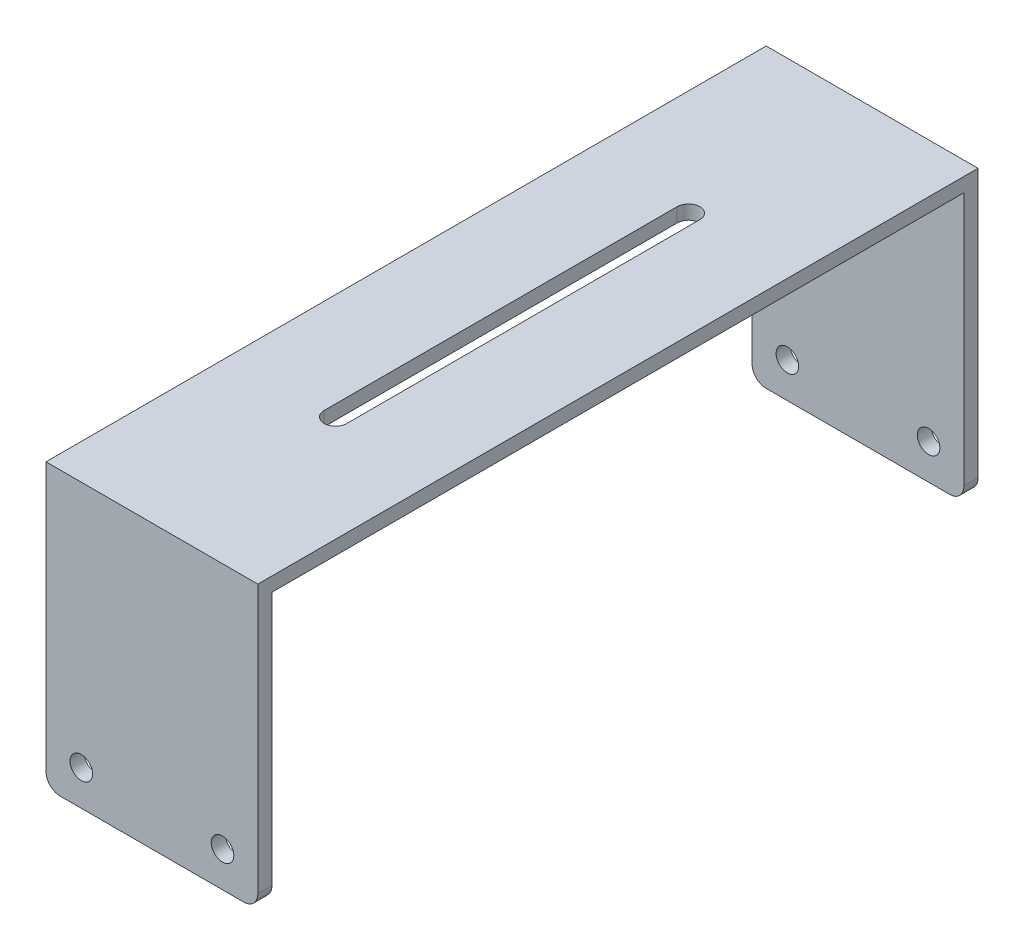
ISO-10303-21;
HEADER;
FILE_DESCRIPTION(('STEP AP214'),'2;1');
FILE_NAME('part.step','',(''),(''),'','','');
FILE_SCHEMA(('AUTOMOTIVE_DESIGN { 1 0 10303 214 1 1 1 1 }'));
ENDSEC;
DATA;
#1=APPLICATION_CONTEXT('core data for automotive mechanical design processes');
#2=APPLICATION_PROTOCOL_DEFINITION('international standard','automotive_design',2000,#1);
#3=PRODUCT_CONTEXT('',#1,'mechanical');
#4=PRODUCT('Part','Part','',(#3));
#5=PRODUCT_RELATED_PRODUCT_CATEGORY('part','',(#4));
#6=PRODUCT_DEFINITION_FORMATION('','',#4);
#7=PRODUCT_DEFINITION_CONTEXT('part definition',#1,'design');
#8=PRODUCT_DEFINITION('design','',#6,#7);
#9=PRODUCT_DEFINITION_SHAPE('','',#8);
#10=(LENGTH_UNIT() NAMED_UNIT(*) SI_UNIT(.MILLI.,.METRE.));
#11=(NAMED_UNIT(*) PLANE_ANGLE_UNIT() SI_UNIT($,.RADIAN.));
#12=(NAMED_UNIT(*) SI_UNIT($,.STERADIAN.) SOLID_ANGLE_UNIT());
#13=UNCERTAINTY_MEASURE_WITH_UNIT(LENGTH_MEASURE(1.E-05),#10,'distance_accuracy_value','');
#14=(GEOMETRIC_REPRESENTATION_CONTEXT(3) GLOBAL_UNCERTAINTY_ASSIGNED_CONTEXT((#13)) GLOBAL_UNIT_ASSIGNED_CONTEXT((#10,
#11,#12)) REPRESENTATION_CONTEXT('',''));
#15=CARTESIAN_POINT('',(0.,0.,0.));
#16=DIRECTION('',(0.,0.,1.));
#17=DIRECTION('',(1.,0.,0.));
#18=AXIS2_PLACEMENT_3D('',#15,#16,#17);
#19=CARTESIAN_POINT('',(30.,38.,-100.));
#20=DIRECTION('',(0.,1.,0.));
#21=DIRECTION('',(0.,0.,1.));
#22=AXIS2_PLACEMENT_3D('',#19,#20,#21);
#23=PLANE('',#22);
#24=DIRECTION('',(0.,0.,-1.));
#25=VECTOR('',#24,1.);
#26=CARTESIAN_POINT('',(13.4,38.,-24.));
#27=LINE('',#26,#25);
#28=CARTESIAN_POINT('',(13.4,38.,-24.));
#29=VERTEX_POINT('',#28);
#30=CARTESIAN_POINT('',(13.4,38.,-74.));
#31=VERTEX_POINT('',#30);
#32=EDGE_CURVE('E427',#29,#31,#27,.T.);
#33=ORIENTED_EDGE('',*,*,#32,.F.);
#34=CARTESIAN_POINT('',(15.,38.,-24.));
#35=DIRECTION('',(0.,1.,0.));
#36=DIRECTION('',(0.,0.,1.));
#37=AXIS2_PLACEMENT_3D('',#34,#35,#36);
#38=CIRCLE('',#37,1.6);
#39=CARTESIAN_POINT('',(16.6,38.,-24.));
#40=VERTEX_POINT('',#39);
#41=EDGE_CURVE('E192',#40,#29,#38,.F.);
#42=ORIENTED_EDGE('',*,*,#41,.F.);
#43=DIRECTION('',(0.,0.,1.));
#44=VECTOR('',#43,1.);
#45=CARTESIAN_POINT('',(16.6,38.,-24.));
#46=LINE('',#45,#44);
#47=CARTESIAN_POINT('',(16.6,38.,-74.));
#48=VERTEX_POINT('',#47);
#49=EDGE_CURVE('E189',#48,#40,#46,.T.);
#50=ORIENTED_EDGE('',*,*,#49,.F.);
#51=CARTESIAN_POINT('',(15.,38.,-74.));
#52=DIRECTION('',(0.,1.,0.));
#53=DIRECTION('',(0.,0.,1.));
#54=AXIS2_PLACEMENT_3D('',#51,#52,#53);
#55=CIRCLE('',#54,1.6);
#56=EDGE_CURVE('E162',#31,#48,#55,.F.);
#57=ORIENTED_EDGE('',*,*,#56,.F.);
#58=EDGE_LOOP('',(#33,#42,#50,#57));
#59=FACE_BOUND('',#58,.T.);
#60=DIRECTION('',(-1.,0.,0.));
#61=VECTOR('',#60,1.);
#62=CARTESIAN_POINT('',(0.,38.,-98.));
#63=LINE('',#62,#61);
#64=CARTESIAN_POINT('',(30.,38.,-98.));
#65=VERTEX_POINT('',#64);
#66=CARTESIAN_POINT('',(0.,38.,-98.));
#67=VERTEX_POINT('',#66);
#68=EDGE_CURVE('E203',#65,#67,#63,.T.);
#69=ORIENTED_EDGE('',*,*,#68,.F.);
#70=DIRECTION('',(0.,0.,1.));
#71=VECTOR('',#70,1.);
#72=CARTESIAN_POINT('',(30.,38.,-100.));
#73=LINE('',#72,#71);
#74=CARTESIAN_POINT('',(30.,38.,0.));
#75=VERTEX_POINT('',#74);
#76=EDGE_CURVE('E226',#65,#75,#73,.T.);
#77=ORIENTED_EDGE('',*,*,#76,.T.);
#78=DIRECTION('',(-1.,0.,0.));
#79=VECTOR('',#78,1.);
#80=CARTESIAN_POINT('',(30.,38.,0.));
#81=LINE('',#80,#79);
#82=CARTESIAN_POINT('',(0.,38.,0.));
#83=VERTEX_POINT('',#82);
#84=EDGE_CURVE('E213',#75,#83,#81,.T.);
#85=ORIENTED_EDGE('',*,*,#84,.T.);
#86=DIRECTION('',(0.,0.,1.));
#87=VECTOR('',#86,1.);
#88=CARTESIAN_POINT('',(0.,38.,-100.));
#89=LINE('',#88,#87);
#90=EDGE_CURVE('E222',#67,#83,#89,.T.);
#91=ORIENTED_EDGE('',*,*,#90,.F.);
#92=EDGE_LOOP('',(#69,#77,#85,#91));
#93=FACE_BOUND('',#92,.T.);
#94=ADVANCED_FACE('F41',(#59,#93),#23,.F.);
#95=CARTESIAN_POINT('',(0.,0.,2.));
#96=DIRECTION('',(0.,0.,-1.));
#97=DIRECTION('',(-1.,0.,0.));
#98=AXIS2_PLACEMENT_3D('',#95,#96,#97);
#99=PLANE('',#98);
#100=DIRECTION('',(1.,0.,0.));
#101=VECTOR('',#100,1.);
#102=CARTESIAN_POINT('',(0.,0.,2.));
#103=LINE('',#102,#101);
#104=CARTESIAN_POINT('',(2.,0.,2.));
#105=VERTEX_POINT('',#104);
#106=CARTESIAN_POINT('',(28.,0.,2.));
#107=VERTEX_POINT('',#106);
#108=EDGE_CURVE('E244',#105,#107,#103,.T.);
#109=ORIENTED_EDGE('',*,*,#108,.T.);
#110=CARTESIAN_POINT('',(28.,2.,2.));
#111=DIRECTION('',(0.,0.,-1.));
#112=DIRECTION('',(-1.,0.,0.));
#113=AXIS2_PLACEMENT_3D('',#110,#111,#112);
#114=CIRCLE('',#113,2.);
#115=CARTESIAN_POINT('',(30.,2.,2.));
#116=VERTEX_POINT('',#115);
#117=EDGE_CURVE('E11',#107,#116,#114,.F.);
#118=ORIENTED_EDGE('',*,*,#117,.T.);
#119=DIRECTION('',(0.,1.,0.));
#120=VECTOR('',#119,1.);
#121=CARTESIAN_POINT('',(30.,0.,2.));
#122=LINE('',#121,#120);
#123=CARTESIAN_POINT('',(30.,40.,2.));
#124=VERTEX_POINT('',#123);
#125=EDGE_CURVE('E247',#116,#124,#122,.T.);
#126=ORIENTED_EDGE('',*,*,#125,.T.);
#127=DIRECTION('',(-1.,0.,0.));
#128=VECTOR('',#127,1.);
#129=CARTESIAN_POINT('',(0.,40.,2.));
#130=LINE('',#129,#128);
#131=CARTESIAN_POINT('',(0.,40.,2.));
#132=VERTEX_POINT('',#131);
#133=EDGE_CURVE('E249',#124,#132,#130,.T.);
#134=ORIENTED_EDGE('',*,*,#133,.T.);
#135=DIRECTION('',(0.,-1.,0.));
#136=VECTOR('',#135,1.);
#137=CARTESIAN_POINT('',(0.,0.,2.));
#138=LINE('',#137,#136);
#139=CARTESIAN_POINT('',(0.,2.,2.));
#140=VERTEX_POINT('',#139);
#141=EDGE_CURVE('E242',#132,#140,#138,.T.);
#142=ORIENTED_EDGE('',*,*,#141,.T.);
#143=CARTESIAN_POINT('',(2.,2.,2.));
#144=DIRECTION('',(0.,0.,-1.));
#145=DIRECTION('',(-1.,0.,0.));
#146=AXIS2_PLACEMENT_3D('',#143,#144,#145);
#147=CIRCLE('',#146,2.);
#148=EDGE_CURVE('E49',#140,#105,#147,.F.);
#149=ORIENTED_EDGE('',*,*,#148,.T.);
#150=EDGE_LOOP('',(#109,#118,#126,#134,#142,#149));
#151=FACE_BOUND('',#150,.T.);
#152=CARTESIAN_POINT('',(5.,5.,2.));
#153=DIRECTION('',(0.,0.,1.));
#154=DIRECTION('',(1.,0.,0.));
#155=AXIS2_PLACEMENT_3D('',#152,#153,#154);
#156=CIRCLE('',#155,1.6);
#157=CARTESIAN_POINT('',(6.6,5.,2.));
#158=VERTEX_POINT('',#157);
#159=EDGE_CURVE('E236',#158,#158,#156,.T.);
#160=ORIENTED_EDGE('',*,*,#159,.F.);
#161=EDGE_LOOP('',(#160));
#162=FACE_BOUND('',#161,.T.);
#163=CARTESIAN_POINT('',(25.,5.,2.));
#164=DIRECTION('',(0.,0.,1.));
#165=DIRECTION('',(1.,0.,0.));
#166=AXIS2_PLACEMENT_3D('',#163,#164,#165);
#167=CIRCLE('',#166,1.6);
#168=CARTESIAN_POINT('',(26.6,5.,2.));
#169=VERTEX_POINT('',#168);
#170=EDGE_CURVE('E230',#169,#169,#167,.T.);
#171=ORIENTED_EDGE('',*,*,#170,.F.);
#172=EDGE_LOOP('',(#171));
#173=FACE_BOUND('',#172,.T.);
#174=ADVANCED_FACE('F317',(#151,#162,#173),#99,.F.);
#175=CARTESIAN_POINT('',(0.,0.,0.));
#176=DIRECTION('',(0.,0.,-1.));
#177=DIRECTION('',(-1.,0.,0.));
#178=AXIS2_PLACEMENT_3D('',#175,#176,#177);
#179=PLANE('',#178);
#180=DIRECTION('',(0.,1.,0.));
#181=VECTOR('',#180,1.);
#182=CARTESIAN_POINT('',(30.,0.,0.));
#183=LINE('',#182,#181);
#184=CARTESIAN_POINT('',(30.,2.,0.));
#185=VERTEX_POINT('',#184);
#186=EDGE_CURVE('E245',#185,#75,#183,.T.);
#187=ORIENTED_EDGE('',*,*,#186,.F.);
#188=CARTESIAN_POINT('',(28.,2.,0.));
#189=DIRECTION('',(0.,0.,-1.));
#190=DIRECTION('',(-1.,0.,0.));
#191=AXIS2_PLACEMENT_3D('',#188,#189,#190);
#192=CIRCLE('',#191,2.);
#193=CARTESIAN_POINT('',(28.,0.,0.));
#194=VERTEX_POINT('',#193);
#195=EDGE_CURVE('E290',#185,#194,#192,.T.);
#196=ORIENTED_EDGE('',*,*,#195,.T.);
#197=DIRECTION('',(1.,0.,0.));
#198=VECTOR('',#197,1.);
#199=CARTESIAN_POINT('',(0.,0.,0.));
#200=LINE('',#199,#198);
#201=CARTESIAN_POINT('',(2.,0.,0.));
#202=VERTEX_POINT('',#201);
#203=EDGE_CURVE('E254',#202,#194,#200,.T.);
#204=ORIENTED_EDGE('',*,*,#203,.F.);
#205=CARTESIAN_POINT('',(2.,2.,0.));
#206=DIRECTION('',(0.,0.,-1.));
#207=DIRECTION('',(-1.,0.,0.));
#208=AXIS2_PLACEMENT_3D('',#205,#206,#207);
#209=CIRCLE('',#208,2.);
#210=CARTESIAN_POINT('',(0.,2.,0.));
#211=VERTEX_POINT('',#210);
#212=EDGE_CURVE('E288',#202,#211,#209,.T.);
#213=ORIENTED_EDGE('',*,*,#212,.T.);
#214=DIRECTION('',(0.,-1.,0.));
#215=VECTOR('',#214,1.);
#216=CARTESIAN_POINT('',(0.,0.,0.));
#217=LINE('',#216,#215);
#218=EDGE_CURVE('E239',#83,#211,#217,.T.);
#219=ORIENTED_EDGE('',*,*,#218,.F.);
#220=ORIENTED_EDGE('',*,*,#84,.F.);
#221=EDGE_LOOP('',(#187,#196,#204,#213,#219,#220));
#222=FACE_BOUND('',#221,.T.);
#223=CARTESIAN_POINT('',(5.,5.,0.));
#224=DIRECTION('',(0.,0.,1.));
#225=DIRECTION('',(1.,0.,0.));
#226=AXIS2_PLACEMENT_3D('',#223,#224,#225);
#227=CIRCLE('',#226,1.6);
#228=CARTESIAN_POINT('',(6.6,5.,0.));
#229=VERTEX_POINT('',#228);
#230=EDGE_CURVE('E233',#229,#229,#227,.T.);
#231=ORIENTED_EDGE('',*,*,#230,.T.);
#232=EDGE_LOOP('',(#231));
#233=FACE_BOUND('',#232,.T.);
#234=CARTESIAN_POINT('',(25.,5.,0.));
#235=DIRECTION('',(0.,0.,1.));
#236=DIRECTION('',(1.,0.,0.));
#237=AXIS2_PLACEMENT_3D('',#234,#235,#236);
#238=CIRCLE('',#237,1.6);
#239=CARTESIAN_POINT('',(26.6,5.,0.));
#240=VERTEX_POINT('',#239);
#241=EDGE_CURVE('E229',#240,#240,#238,.T.);
#242=ORIENTED_EDGE('',*,*,#241,.T.);
#243=EDGE_LOOP('',(#242));
#244=FACE_BOUND('',#243,.T.);
#245=ADVANCED_FACE('F301',(#222,#233,#244),#179,.T.);
#246=CARTESIAN_POINT('',(0.,0.,2.));
#247=DIRECTION('',(1.,0.,0.));
#248=DIRECTION('',(0.,1.,0.));
#249=AXIS2_PLACEMENT_3D('',#246,#247,#248);
#250=PLANE('',#249);
#251=DIRECTION('',(0.,1.,0.));
#252=VECTOR('',#251,1.);
#253=CARTESIAN_POINT('',(0.,40.,-100.));
#254=LINE('',#253,#252);
#255=CARTESIAN_POINT('',(0.,2.,-100.));
#256=VERTEX_POINT('',#255);
#257=CARTESIAN_POINT('',(0.,40.,-100.));
#258=VERTEX_POINT('',#257);
#259=EDGE_CURVE('E217',#256,#258,#254,.T.);
#260=ORIENTED_EDGE('',*,*,#259,.F.);
#261=DIRECTION('',(0.,0.,-1.));
#262=VECTOR('',#261,1.);
#263=CARTESIAN_POINT('',(0.,2.,-98.));
#264=LINE('',#263,#262);
#265=CARTESIAN_POINT('',(0.,2.,-98.));
#266=VERTEX_POINT('',#265);
#267=EDGE_CURVE('E286',#256,#266,#264,.F.);
#268=ORIENTED_EDGE('',*,*,#267,.T.);
#269=DIRECTION('',(0.,1.,0.));
#270=VECTOR('',#269,1.);
#271=CARTESIAN_POINT('',(0.,0.,-98.));
#272=LINE('',#271,#270);
#273=EDGE_CURVE('E206',#266,#67,#272,.T.);
#274=ORIENTED_EDGE('',*,*,#273,.T.);
#275=ORIENTED_EDGE('',*,*,#90,.T.);
#276=ORIENTED_EDGE('',*,*,#218,.T.);
#277=DIRECTION('',(0.,0.,-1.));
#278=VECTOR('',#277,1.);
#279=CARTESIAN_POINT('',(0.,2.,2.));
#280=LINE('',#279,#278);
#281=EDGE_CURVE('E284',#211,#140,#280,.F.);
#282=ORIENTED_EDGE('',*,*,#281,.T.);
#283=ORIENTED_EDGE('',*,*,#141,.F.);
#284=DIRECTION('',(0.,0.,-1.));
#285=VECTOR('',#284,1.);
#286=CARTESIAN_POINT('',(0.,40.,2.));
#287=LINE('',#286,#285);
#288=EDGE_CURVE('E251',#132,#258,#287,.T.);
#289=ORIENTED_EDGE('',*,*,#288,.T.);
#290=EDGE_LOOP('',(#260,#268,#274,#275,#276,#282,#283,#289));
#291=FACE_BOUND('',#290,.T.);
#292=ADVANCED_FACE('F324',(#291),#250,.F.);
#293=CARTESIAN_POINT('',(0.,0.,2.));
#294=DIRECTION('',(0.,1.,0.));
#295=DIRECTION('',(0.,0.,1.));
#296=AXIS2_PLACEMENT_3D('',#293,#294,#295);
#297=PLANE('',#296);
#298=ORIENTED_EDGE('',*,*,#203,.T.);
#299=DIRECTION('',(0.,0.,-1.));
#300=VECTOR('',#299,1.);
#301=CARTESIAN_POINT('',(28.,0.,2.));
#302=LINE('',#301,#300);
#303=EDGE_CURVE('E56',#194,#107,#302,.F.);
#304=ORIENTED_EDGE('',*,*,#303,.T.);
#305=ORIENTED_EDGE('',*,*,#108,.F.);
#306=DIRECTION('',(0.,0.,-1.));
#307=VECTOR('',#306,1.);
#308=CARTESIAN_POINT('',(2.,0.,2.));
#309=LINE('',#308,#307);
#310=EDGE_CURVE('E292',#105,#202,#309,.T.);
#311=ORIENTED_EDGE('',*,*,#310,.T.);
#312=EDGE_LOOP('',(#298,#304,#305,#311));
#313=FACE_BOUND('',#312,.T.);
#314=ADVANCED_FACE('F297',(#313),#297,.F.);
#315=CARTESIAN_POINT('',(30.,0.,2.));
#316=DIRECTION('',(-1.,0.,0.));
#317=DIRECTION('',(0.,-1.,0.));
#318=AXIS2_PLACEMENT_3D('',#315,#316,#317);
#319=PLANE('',#318);
#320=DIRECTION('',(0.,1.,0.));
#321=VECTOR('',#320,1.);
#322=CARTESIAN_POINT('',(30.,0.,-98.));
#323=LINE('',#322,#321);
#324=CARTESIAN_POINT('',(30.,2.,-98.));
#325=VERTEX_POINT('',#324);
#326=EDGE_CURVE('E211',#325,#65,#323,.T.);
#327=ORIENTED_EDGE('',*,*,#326,.F.);
#328=DIRECTION('',(0.,0.,1.));
#329=VECTOR('',#328,1.);
#330=CARTESIAN_POINT('',(30.,2.,-100.));
#331=LINE('',#330,#329);
#332=CARTESIAN_POINT('',(30.,2.,-100.));
#333=VERTEX_POINT('',#332);
#334=EDGE_CURVE('E278',#325,#333,#331,.F.);
#335=ORIENTED_EDGE('',*,*,#334,.T.);
#336=DIRECTION('',(0.,-1.,0.));
#337=VECTOR('',#336,1.);
#338=CARTESIAN_POINT('',(30.,40.,-100.));
#339=LINE('',#338,#337);
#340=CARTESIAN_POINT('',(30.,40.,-100.));
#341=VERTEX_POINT('',#340);
#342=EDGE_CURVE('E214',#341,#333,#339,.T.);
#343=ORIENTED_EDGE('',*,*,#342,.F.);
#344=DIRECTION('',(0.,0.,-1.));
#345=VECTOR('',#344,1.);
#346=CARTESIAN_POINT('',(30.,40.,2.));
#347=LINE('',#346,#345);
#348=EDGE_CURVE('E259',#124,#341,#347,.T.);
#349=ORIENTED_EDGE('',*,*,#348,.F.);
#350=ORIENTED_EDGE('',*,*,#125,.F.);
#351=DIRECTION('',(0.,0.,-1.));
#352=VECTOR('',#351,1.);
#353=CARTESIAN_POINT('',(30.,2.,2.));
#354=LINE('',#353,#352);
#355=EDGE_CURVE('E275',#116,#185,#354,.T.);
#356=ORIENTED_EDGE('',*,*,#355,.T.);
#357=ORIENTED_EDGE('',*,*,#186,.T.);
#358=ORIENTED_EDGE('',*,*,#76,.F.);
#359=EDGE_LOOP('',(#327,#335,#343,#349,#350,#356,#357,#358));
#360=FACE_BOUND('',#359,.T.);
#361=ADVANCED_FACE('F312',(#360),#319,.F.);
#362=CARTESIAN_POINT('',(0.,40.,2.));
#363=DIRECTION('',(0.,-1.,0.));
#364=DIRECTION('',(0.,0.,-1.));
#365=AXIS2_PLACEMENT_3D('',#362,#363,#364);
#366=PLANE('',#365);
#367=DIRECTION('',(0.,0.,-1.));
#368=VECTOR('',#367,1.);
#369=CARTESIAN_POINT('',(16.6,40.,-24.));
#370=LINE('',#369,#368);
#371=CARTESIAN_POINT('',(16.6,40.,-24.));
#372=VERTEX_POINT('',#371);
#373=CARTESIAN_POINT('',(16.6,40.,-74.));
#374=VERTEX_POINT('',#373);
#375=EDGE_CURVE('E170',#372,#374,#370,.T.);
#376=ORIENTED_EDGE('',*,*,#375,.F.);
#377=CARTESIAN_POINT('',(15.,40.,-24.));
#378=DIRECTION('',(0.,1.,0.));
#379=DIRECTION('',(0.,0.,1.));
#380=AXIS2_PLACEMENT_3D('',#377,#378,#379);
#381=CIRCLE('',#380,1.6);
#382=CARTESIAN_POINT('',(13.4,40.,-24.));
#383=VERTEX_POINT('',#382);
#384=EDGE_CURVE('E175',#383,#372,#381,.T.);
#385=ORIENTED_EDGE('',*,*,#384,.F.);
#386=DIRECTION('',(0.,0.,1.));
#387=VECTOR('',#386,1.);
#388=CARTESIAN_POINT('',(13.4,40.,-24.));
#389=LINE('',#388,#387);
#390=CARTESIAN_POINT('',(13.4,40.,-74.));
#391=VERTEX_POINT('',#390);
#392=EDGE_CURVE('E180',#391,#383,#389,.T.);
#393=ORIENTED_EDGE('',*,*,#392,.F.);
#394=CARTESIAN_POINT('',(15.,40.,-74.));
#395=DIRECTION('',(0.,1.,0.));
#396=DIRECTION('',(0.,0.,1.));
#397=AXIS2_PLACEMENT_3D('',#394,#395,#396);
#398=CIRCLE('',#397,1.6);
#399=EDGE_CURVE('E159',#374,#391,#398,.T.);
#400=ORIENTED_EDGE('',*,*,#399,.F.);
#401=EDGE_LOOP('',(#376,#385,#393,#400));
#402=FACE_BOUND('',#401,.T.);
#403=ORIENTED_EDGE('',*,*,#348,.T.);
#404=DIRECTION('',(1.,0.,0.));
#405=VECTOR('',#404,1.);
#406=CARTESIAN_POINT('',(30.,40.,-100.));
#407=LINE('',#406,#405);
#408=EDGE_CURVE('E219',#258,#341,#407,.T.);
#409=ORIENTED_EDGE('',*,*,#408,.F.);
#410=ORIENTED_EDGE('',*,*,#288,.F.);
#411=ORIENTED_EDGE('',*,*,#133,.F.);
#412=EDGE_LOOP('',(#403,#409,#410,#411));
#413=FACE_BOUND('',#412,.T.);
#414=ADVANCED_FACE('F177',(#402,#413),#366,.F.);
#415=CARTESIAN_POINT('',(5.,5.,2.));
#416=DIRECTION('',(0.,0.,-1.));
#417=DIRECTION('',(-1.,0.,0.));
#418=AXIS2_PLACEMENT_3D('',#415,#416,#417);
#419=CYLINDRICAL_SURFACE('',#418,1.6);
#420=ORIENTED_EDGE('',*,*,#159,.T.);
#421=EDGE_LOOP('',(#420));
#422=FACE_BOUND('',#421,.T.);
#423=ORIENTED_EDGE('',*,*,#230,.F.);
#424=EDGE_LOOP('',(#423));
#425=FACE_BOUND('',#424,.T.);
#426=ADVANCED_FACE('F348',(#422,#425),#419,.F.);
#427=CARTESIAN_POINT('',(25.,5.,2.));
#428=DIRECTION('',(0.,0.,-1.));
#429=DIRECTION('',(-1.,0.,0.));
#430=AXIS2_PLACEMENT_3D('',#427,#428,#429);
#431=CYLINDRICAL_SURFACE('',#430,1.6);
#432=ORIENTED_EDGE('',*,*,#170,.T.);
#433=EDGE_LOOP('',(#432));
#434=FACE_BOUND('',#433,.T.);
#435=ORIENTED_EDGE('',*,*,#241,.F.);
#436=EDGE_LOOP('',(#435));
#437=FACE_BOUND('',#436,.T.);
#438=ADVANCED_FACE('F345',(#434,#437),#431,.F.);
#439=CARTESIAN_POINT('',(0.,0.,-100.));
#440=DIRECTION('',(0.,0.,-1.));
#441=DIRECTION('',(-1.,0.,0.));
#442=AXIS2_PLACEMENT_3D('',#439,#440,#441);
#443=PLANE('',#442);
#444=CARTESIAN_POINT('',(5.,5.,-100.));
#445=DIRECTION('',(0.,0.,1.));
#446=DIRECTION('',(1.,0.,0.));
#447=AXIS2_PLACEMENT_3D('',#444,#445,#446);
#448=CIRCLE('',#447,1.6);
#449=CARTESIAN_POINT('',(6.6,5.,-100.));
#450=VERTEX_POINT('',#449);
#451=EDGE_CURVE('E193',#450,#450,#448,.T.);
#452=ORIENTED_EDGE('',*,*,#451,.T.);
#453=EDGE_LOOP('',(#452));
#454=FACE_BOUND('',#453,.T.);
#455=CARTESIAN_POINT('',(25.,5.,-100.));
#456=DIRECTION('',(0.,0.,1.));
#457=DIRECTION('',(1.,0.,0.));
#458=AXIS2_PLACEMENT_3D('',#455,#456,#457);
#459=CIRCLE('',#458,1.6);
#460=CARTESIAN_POINT('',(26.6,5.,-100.));
#461=VERTEX_POINT('',#460);
#462=EDGE_CURVE('E191',#461,#461,#459,.T.);
#463=ORIENTED_EDGE('',*,*,#462,.T.);
#464=EDGE_LOOP('',(#463));
#465=FACE_BOUND('',#464,.T.);
#466=ORIENTED_EDGE('',*,*,#342,.T.);
#467=CARTESIAN_POINT('',(28.,2.,-100.));
#468=DIRECTION('',(0.,0.,-1.));
#469=DIRECTION('',(-1.,0.,0.));
#470=AXIS2_PLACEMENT_3D('',#467,#468,#469);
#471=CIRCLE('',#470,2.);
#472=CARTESIAN_POINT('',(28.,0.,-100.));
#473=VERTEX_POINT('',#472);
#474=EDGE_CURVE('E282',#333,#473,#471,.T.);
#475=ORIENTED_EDGE('',*,*,#474,.T.);
#476=DIRECTION('',(1.,0.,0.));
#477=VECTOR('',#476,1.);
#478=CARTESIAN_POINT('',(0.,0.,-100.));
#479=LINE('',#478,#477);
#480=CARTESIAN_POINT('',(2.,0.,-100.));
#481=VERTEX_POINT('',#480);
#482=EDGE_CURVE('E199',#481,#473,#479,.T.);
#483=ORIENTED_EDGE('',*,*,#482,.F.);
#484=CARTESIAN_POINT('',(2.,2.,-100.));
#485=DIRECTION('',(0.,0.,-1.));
#486=DIRECTION('',(-1.,0.,0.));
#487=AXIS2_PLACEMENT_3D('',#484,#485,#486);
#488=CIRCLE('',#487,2.);
#489=EDGE_CURVE('E280',#481,#256,#488,.T.);
#490=ORIENTED_EDGE('',*,*,#489,.T.);
#491=ORIENTED_EDGE('',*,*,#259,.T.);
#492=ORIENTED_EDGE('',*,*,#408,.T.);
#493=EDGE_LOOP('',(#466,#475,#483,#490,#491,#492));
#494=FACE_BOUND('',#493,.T.);
#495=ADVANCED_FACE('F343',(#454,#465,#494),#443,.T.);
#496=CARTESIAN_POINT('',(0.,0.,-98.));
#497=DIRECTION('',(0.,0.,-1.));
#498=DIRECTION('',(-1.,0.,0.));
#499=AXIS2_PLACEMENT_3D('',#496,#497,#498);
#500=PLANE('',#499);
#501=CARTESIAN_POINT('',(5.,5.,-98.));
#502=DIRECTION('',(0.,0.,-1.));
#503=DIRECTION('',(-1.,0.,0.));
#504=AXIS2_PLACEMENT_3D('',#501,#502,#503);
#505=CIRCLE('',#504,1.6);
#506=CARTESIAN_POINT('',(3.4,5.,-98.));
#507=VERTEX_POINT('',#506);
#508=EDGE_CURVE('E209',#507,#507,#505,.T.);
#509=ORIENTED_EDGE('',*,*,#508,.T.);
#510=EDGE_LOOP('',(#509));
#511=FACE_BOUND('',#510,.T.);
#512=CARTESIAN_POINT('',(25.,5.,-98.));
#513=DIRECTION('',(0.,0.,-1.));
#514=DIRECTION('',(-1.,0.,0.));
#515=AXIS2_PLACEMENT_3D('',#512,#513,#514);
#516=CIRCLE('',#515,1.6);
#517=CARTESIAN_POINT('',(23.4,5.,-98.));
#518=VERTEX_POINT('',#517);
#519=EDGE_CURVE('E196',#518,#518,#516,.T.);
#520=ORIENTED_EDGE('',*,*,#519,.T.);
#521=EDGE_LOOP('',(#520));
#522=FACE_BOUND('',#521,.T.);
#523=DIRECTION('',(-1.,0.,0.));
#524=VECTOR('',#523,1.);
#525=CARTESIAN_POINT('',(0.,0.,-98.));
#526=LINE('',#525,#524);
#527=CARTESIAN_POINT('',(28.,0.,-98.));
#528=VERTEX_POINT('',#527);
#529=CARTESIAN_POINT('',(2.,0.,-98.));
#530=VERTEX_POINT('',#529);
#531=EDGE_CURVE('E202',#528,#530,#526,.T.);
#532=ORIENTED_EDGE('',*,*,#531,.F.);
#533=CARTESIAN_POINT('',(28.,2.,-98.));
#534=DIRECTION('',(0.,0.,-1.));
#535=DIRECTION('',(-1.,0.,0.));
#536=AXIS2_PLACEMENT_3D('',#533,#534,#535);
#537=CIRCLE('',#536,2.);
#538=EDGE_CURVE('E273',#528,#325,#537,.F.);
#539=ORIENTED_EDGE('',*,*,#538,.T.);
#540=ORIENTED_EDGE('',*,*,#326,.T.);
#541=ORIENTED_EDGE('',*,*,#68,.T.);
#542=ORIENTED_EDGE('',*,*,#273,.F.);
#543=CARTESIAN_POINT('',(2.,2.,-98.));
#544=DIRECTION('',(0.,0.,-1.));
#545=DIRECTION('',(-1.,0.,0.));
#546=AXIS2_PLACEMENT_3D('',#543,#544,#545);
#547=CIRCLE('',#546,2.);
#548=EDGE_CURVE('E271',#266,#530,#547,.F.);
#549=ORIENTED_EDGE('',*,*,#548,.T.);
#550=EDGE_LOOP('',(#532,#539,#540,#541,#542,#549));
#551=FACE_BOUND('',#550,.T.);
#552=ADVANCED_FACE('F377',(#511,#522,#551),#500,.F.);
#553=CARTESIAN_POINT('',(0.,0.,0.));
#554=DIRECTION('',(0.,-1.,0.));
#555=DIRECTION('',(0.,0.,-1.));
#556=AXIS2_PLACEMENT_3D('',#553,#554,#555);
#557=PLANE('',#556);
#558=ORIENTED_EDGE('',*,*,#482,.T.);
#559=DIRECTION('',(0.,0.,1.));
#560=VECTOR('',#559,1.);
#561=CARTESIAN_POINT('',(28.,0.,-98.));
#562=LINE('',#561,#560);
#563=EDGE_CURVE('E268',#473,#528,#562,.T.);
#564=ORIENTED_EDGE('',*,*,#563,.T.);
#565=ORIENTED_EDGE('',*,*,#531,.T.);
#566=DIRECTION('',(0.,0.,-1.));
#567=VECTOR('',#566,1.);
#568=CARTESIAN_POINT('',(2.,0.,-100.));
#569=LINE('',#568,#567);
#570=EDGE_CURVE('E261',#530,#481,#569,.T.);
#571=ORIENTED_EDGE('',*,*,#570,.T.);
#572=EDGE_LOOP('',(#558,#564,#565,#571));
#573=FACE_BOUND('',#572,.T.);
#574=ADVANCED_FACE('F379',(#573),#557,.T.);
#575=CARTESIAN_POINT('',(25.,5.,-100.));
#576=DIRECTION('',(0.,0.,1.));
#577=DIRECTION('',(1.,0.,0.));
#578=AXIS2_PLACEMENT_3D('',#575,#576,#577);
#579=CYLINDRICAL_SURFACE('',#578,1.6);
#580=ORIENTED_EDGE('',*,*,#462,.F.);
#581=EDGE_LOOP('',(#580));
#582=FACE_BOUND('',#581,.T.);
#583=ORIENTED_EDGE('',*,*,#519,.F.);
#584=EDGE_LOOP('',(#583));
#585=FACE_BOUND('',#584,.T.);
#586=ADVANCED_FACE('F397',(#582,#585),#579,.F.);
#587=CARTESIAN_POINT('',(5.,5.,-100.));
#588=DIRECTION('',(0.,0.,1.));
#589=DIRECTION('',(1.,0.,0.));
#590=AXIS2_PLACEMENT_3D('',#587,#588,#589);
#591=CYLINDRICAL_SURFACE('',#590,1.6);
#592=ORIENTED_EDGE('',*,*,#451,.F.);
#593=EDGE_LOOP('',(#592));
#594=FACE_BOUND('',#593,.T.);
#595=ORIENTED_EDGE('',*,*,#508,.F.);
#596=EDGE_LOOP('',(#595));
#597=FACE_BOUND('',#596,.T.);
#598=ADVANCED_FACE('F400',(#594,#597),#591,.F.);
#599=CARTESIAN_POINT('',(15.,-15.2961537073737,-24.));
#600=DIRECTION('',(0.,1.,0.));
#601=DIRECTION('',(0.,0.,1.));
#602=AXIS2_PLACEMENT_3D('',#599,#600,#601);
#603=CYLINDRICAL_SURFACE('',#602,1.6);
#604=ORIENTED_EDGE('',*,*,#41,.T.);
#605=DIRECTION('',(0.,1.,0.));
#606=VECTOR('',#605,1.);
#607=CARTESIAN_POINT('',(13.4,-15.2961537073737,-24.));
#608=LINE('',#607,#606);
#609=EDGE_CURVE('E185',#29,#383,#608,.T.);
#610=ORIENTED_EDGE('',*,*,#609,.T.);
#611=ORIENTED_EDGE('',*,*,#384,.T.);
#612=DIRECTION('',(0.,1.,0.));
#613=VECTOR('',#612,1.);
#614=CARTESIAN_POINT('',(16.6,-15.2961537073737,-24.));
#615=LINE('',#614,#613);
#616=EDGE_CURVE('E166',#40,#372,#615,.T.);
#617=ORIENTED_EDGE('',*,*,#616,.F.);
#618=EDGE_LOOP('',(#604,#610,#611,#617));
#619=FACE_BOUND('',#618,.T.);
#620=ADVANCED_FACE('F408',(#619),#603,.F.);
#621=CARTESIAN_POINT('',(13.4,-15.2961537073737,-24.));
#622=DIRECTION('',(-1.,0.,0.));
#623=DIRECTION('',(0.,0.,1.));
#624=AXIS2_PLACEMENT_3D('',#621,#622,#623);
#625=PLANE('',#624);
#626=ORIENTED_EDGE('',*,*,#32,.T.);
#627=DIRECTION('',(0.,1.,0.));
#628=VECTOR('',#627,1.);
#629=CARTESIAN_POINT('',(13.4,-15.2961537073737,-74.));
#630=LINE('',#629,#628);
#631=EDGE_CURVE('E165',#31,#391,#630,.T.);
#632=ORIENTED_EDGE('',*,*,#631,.T.);
#633=ORIENTED_EDGE('',*,*,#392,.T.);
#634=ORIENTED_EDGE('',*,*,#609,.F.);
#635=EDGE_LOOP('',(#626,#632,#633,#634));
#636=FACE_BOUND('',#635,.T.);
#637=ADVANCED_FACE('F416',(#636),#625,.F.);
#638=CARTESIAN_POINT('',(15.,-15.2961537073737,-74.));
#639=DIRECTION('',(0.,1.,0.));
#640=DIRECTION('',(0.,0.,1.));
#641=AXIS2_PLACEMENT_3D('',#638,#639,#640);
#642=CYLINDRICAL_SURFACE('',#641,1.6);
#643=ORIENTED_EDGE('',*,*,#56,.T.);
#644=DIRECTION('',(0.,1.,0.));
#645=VECTOR('',#644,1.);
#646=CARTESIAN_POINT('',(16.6,-15.2961537073737,-74.));
#647=LINE('',#646,#645);
#648=EDGE_CURVE('E154',#48,#374,#647,.T.);
#649=ORIENTED_EDGE('',*,*,#648,.T.);
#650=ORIENTED_EDGE('',*,*,#399,.T.);
#651=ORIENTED_EDGE('',*,*,#631,.F.);
#652=EDGE_LOOP('',(#643,#649,#650,#651));
#653=FACE_BOUND('',#652,.T.);
#654=ADVANCED_FACE('F156',(#653),#642,.F.);
#655=CARTESIAN_POINT('',(16.6,-15.2961537073737,-24.));
#656=DIRECTION('',(1.,0.,0.));
#657=DIRECTION('',(0.,0.,-1.));
#658=AXIS2_PLACEMENT_3D('',#655,#656,#657);
#659=PLANE('',#658);
#660=ORIENTED_EDGE('',*,*,#49,.T.);
#661=ORIENTED_EDGE('',*,*,#616,.T.);
#662=ORIENTED_EDGE('',*,*,#375,.T.);
#663=ORIENTED_EDGE('',*,*,#648,.F.);
#664=EDGE_LOOP('',(#660,#661,#662,#663));
#665=FACE_BOUND('',#664,.T.);
#666=ADVANCED_FACE('F171',(#665),#659,.F.);
#667=CARTESIAN_POINT('',(28.,2.,0.));
#668=DIRECTION('',(0.,0.,-1.));
#669=DIRECTION('',(-1.,0.,0.));
#670=AXIS2_PLACEMENT_3D('',#667,#668,#669);
#671=CYLINDRICAL_SURFACE('',#670,2.);
#672=ORIENTED_EDGE('',*,*,#474,.F.);
#673=ORIENTED_EDGE('',*,*,#334,.F.);
#674=ORIENTED_EDGE('',*,*,#538,.F.);
#675=ORIENTED_EDGE('',*,*,#563,.F.);
#676=EDGE_LOOP('',(#672,#673,#674,#675));
#677=FACE_BOUND('',#676,.T.);
#678=ADVANCED_FACE('F363',(#677),#671,.T.);
#679=CARTESIAN_POINT('',(2.,2.,0.));
#680=DIRECTION('',(0.,0.,1.));
#681=DIRECTION('',(1.,0.,0.));
#682=AXIS2_PLACEMENT_3D('',#679,#680,#681);
#683=CYLINDRICAL_SURFACE('',#682,2.);
#684=ORIENTED_EDGE('',*,*,#548,.F.);
#685=ORIENTED_EDGE('',*,*,#267,.F.);
#686=ORIENTED_EDGE('',*,*,#489,.F.);
#687=ORIENTED_EDGE('',*,*,#570,.F.);
#688=EDGE_LOOP('',(#684,#685,#686,#687));
#689=FACE_BOUND('',#688,.T.);
#690=ADVANCED_FACE('F330',(#689),#683,.T.);
#691=CARTESIAN_POINT('',(28.,2.,2.));
#692=DIRECTION('',(0.,0.,-1.));
#693=DIRECTION('',(-1.,0.,0.));
#694=AXIS2_PLACEMENT_3D('',#691,#692,#693);
#695=CYLINDRICAL_SURFACE('',#694,2.);
#696=ORIENTED_EDGE('',*,*,#117,.F.);
#697=ORIENTED_EDGE('',*,*,#303,.F.);
#698=ORIENTED_EDGE('',*,*,#195,.F.);
#699=ORIENTED_EDGE('',*,*,#355,.F.);
#700=EDGE_LOOP('',(#696,#697,#698,#699));
#701=FACE_BOUND('',#700,.T.);
#702=ADVANCED_FACE('F308',(#701),#695,.T.);
#703=CARTESIAN_POINT('',(2.,2.,2.));
#704=DIRECTION('',(0.,0.,-1.));
#705=DIRECTION('',(-1.,0.,0.));
#706=AXIS2_PLACEMENT_3D('',#703,#704,#705);
#707=CYLINDRICAL_SURFACE('',#706,2.);
#708=ORIENTED_EDGE('',*,*,#148,.F.);
#709=ORIENTED_EDGE('',*,*,#281,.F.);
#710=ORIENTED_EDGE('',*,*,#212,.F.);
#711=ORIENTED_EDGE('',*,*,#310,.F.);
#712=EDGE_LOOP('',(#708,#709,#710,#711));
#713=FACE_BOUND('',#712,.T.);
#714=ADVANCED_FACE('F43',(#713),#707,.T.);
#715=CLOSED_SHELL('',(#94,#174,#245,#292,#314,#361,#414,#426,#438,#495,#552,#574,#586,#598,#620,
#637,#654,#666,#678,#690,#702,#714));
#716=MANIFOLD_SOLID_BREP('B2',#715);
#717=ADVANCED_BREP_SHAPE_REPRESENTATION('',(#18,#716),#14);
#718=SHAPE_DEFINITION_REPRESENTATION(#9,#717);
ENDSEC;
END-ISO-10303-21;
